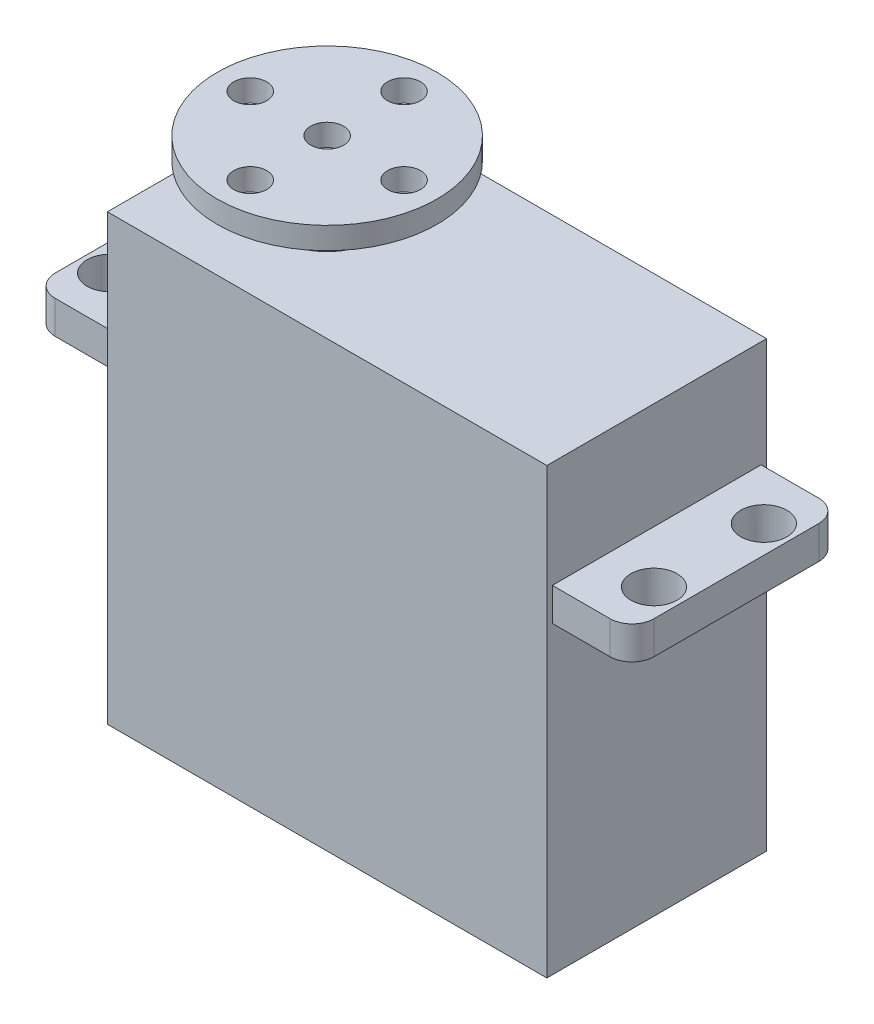
ISO-10303-21;
HEADER;
FILE_DESCRIPTION(('STEP AP214'),'2;1');
FILE_NAME('part.step','',(''),(''),'','','');
FILE_SCHEMA(('AUTOMOTIVE_DESIGN { 1 0 10303 214 1 1 1 1 }'));
ENDSEC;
DATA;
#1=APPLICATION_CONTEXT('core data for automotive mechanical design processes');
#2=APPLICATION_PROTOCOL_DEFINITION('international standard','automotive_design',2000,#1);
#3=PRODUCT_CONTEXT('',#1,'mechanical');
#4=PRODUCT('Part','Part','',(#3));
#5=PRODUCT_RELATED_PRODUCT_CATEGORY('part','',(#4));
#6=PRODUCT_DEFINITION_FORMATION('','',#4);
#7=PRODUCT_DEFINITION_CONTEXT('part definition',#1,'design');
#8=PRODUCT_DEFINITION('design','',#6,#7);
#9=PRODUCT_DEFINITION_SHAPE('','',#8);
#10=(LENGTH_UNIT() NAMED_UNIT(*) SI_UNIT(.MILLI.,.METRE.));
#11=(NAMED_UNIT(*) PLANE_ANGLE_UNIT() SI_UNIT($,.RADIAN.));
#12=(NAMED_UNIT(*) SI_UNIT($,.STERADIAN.) SOLID_ANGLE_UNIT());
#13=UNCERTAINTY_MEASURE_WITH_UNIT(LENGTH_MEASURE(1.E-05),#10,'distance_accuracy_value','');
#14=(GEOMETRIC_REPRESENTATION_CONTEXT(3) GLOBAL_UNCERTAINTY_ASSIGNED_CONTEXT((#13)) GLOBAL_UNIT_ASSIGNED_CONTEXT((#10,
#11,#12)) REPRESENTATION_CONTEXT('',''));
#15=CARTESIAN_POINT('',(0.,0.,0.));
#16=DIRECTION('',(0.,0.,1.));
#17=DIRECTION('',(1.,0.,0.));
#18=AXIS2_PLACEMENT_3D('',#15,#16,#17);
#19=CARTESIAN_POINT('',(-10.,32.55,0.));
#20=DIRECTION('',(0.,1.,0.));
#21=DIRECTION('',(0.,0.,1.));
#22=AXIS2_PLACEMENT_3D('',#19,#20,#21);
#23=PLANE('',#22);
#24=CARTESIAN_POINT('',(-17.,32.55,0.));
#25=DIRECTION('',(0.,1.,0.));
#26=DIRECTION('',(0.,0.,1.));
#27=AXIS2_PLACEMENT_3D('',#24,#25,#26);
#28=CIRCLE('',#27,1.5);
#29=CARTESIAN_POINT('',(-17.,32.55,1.5));
#30=VERTEX_POINT('',#29);
#31=EDGE_CURVE('E102',#30,#30,#28,.T.);
#32=ORIENTED_EDGE('',*,*,#31,.F.);
#33=EDGE_LOOP('',(#32));
#34=FACE_BOUND('',#33,.T.);
#35=CARTESIAN_POINT('',(-3.,32.55,0.));
#36=DIRECTION('',(0.,1.,0.));
#37=DIRECTION('',(0.,0.,1.));
#38=AXIS2_PLACEMENT_3D('',#35,#36,#37);
#39=CIRCLE('',#38,1.5);
#40=CARTESIAN_POINT('',(-3.,32.55,1.5));
#41=VERTEX_POINT('',#40);
#42=EDGE_CURVE('E90',#41,#41,#39,.T.);
#43=ORIENTED_EDGE('',*,*,#42,.F.);
#44=EDGE_LOOP('',(#43));
#45=FACE_BOUND('',#44,.T.);
#46=CARTESIAN_POINT('',(-10.,32.55,0.));
#47=DIRECTION('',(0.,1.,0.));
#48=DIRECTION('',(0.,0.,1.));
#49=AXIS2_PLACEMENT_3D('',#46,#47,#48);
#50=CIRCLE('',#49,10.);
#51=CARTESIAN_POINT('',(-10.,32.55,10.));
#52=VERTEX_POINT('',#51);
#53=EDGE_CURVE('E12',#52,#52,#50,.T.);
#54=ORIENTED_EDGE('',*,*,#53,.T.);
#55=EDGE_LOOP('',(#54));
#56=FACE_BOUND('',#55,.T.);
#57=CARTESIAN_POINT('',(-10.,32.55,-7.));
#58=DIRECTION('',(0.,1.,0.));
#59=DIRECTION('',(0.,0.,1.));
#60=AXIS2_PLACEMENT_3D('',#57,#58,#59);
#61=CIRCLE('',#60,1.5);
#62=CARTESIAN_POINT('',(-10.,32.55,-5.5));
#63=VERTEX_POINT('',#62);
#64=EDGE_CURVE('E85',#63,#63,#61,.T.);
#65=ORIENTED_EDGE('',*,*,#64,.F.);
#66=EDGE_LOOP('',(#65));
#67=FACE_BOUND('',#66,.T.);
#68=CARTESIAN_POINT('',(-10.,32.55,7.));
#69=DIRECTION('',(0.,1.,0.));
#70=DIRECTION('',(0.,0.,1.));
#71=AXIS2_PLACEMENT_3D('',#68,#69,#70);
#72=CIRCLE('',#71,1.5);
#73=CARTESIAN_POINT('',(-10.,32.55,8.5));
#74=VERTEX_POINT('',#73);
#75=EDGE_CURVE('E96',#74,#74,#72,.T.);
#76=ORIENTED_EDGE('',*,*,#75,.F.);
#77=EDGE_LOOP('',(#76));
#78=FACE_BOUND('',#77,.T.);
#79=CARTESIAN_POINT('',(-10.,32.55,0.));
#80=DIRECTION('',(0.,1.,0.));
#81=DIRECTION('',(0.,0.,1.));
#82=AXIS2_PLACEMENT_3D('',#79,#80,#81);
#83=CIRCLE('',#82,1.5);
#84=CARTESIAN_POINT('',(-10.,32.55,1.5));
#85=VERTEX_POINT('',#84);
#86=EDGE_CURVE('E108',#85,#85,#83,.T.);
#87=ORIENTED_EDGE('',*,*,#86,.F.);
#88=EDGE_LOOP('',(#87));
#89=FACE_BOUND('',#88,.T.);
#90=ADVANCED_FACE('F74',(#34,#45,#56,#67,#78,#89),#23,.T.);
#91=CARTESIAN_POINT('',(-10.,30.55,0.));
#92=DIRECTION('',(0.,1.,0.));
#93=DIRECTION('',(0.,0.,1.));
#94=AXIS2_PLACEMENT_3D('',#91,#92,#93);
#95=PLANE('',#94);
#96=CARTESIAN_POINT('',(-10.,30.55,0.));
#97=DIRECTION('',(0.,1.,0.));
#98=DIRECTION('',(0.,0.,1.));
#99=AXIS2_PLACEMENT_3D('',#96,#97,#98);
#100=CIRCLE('',#99,10.);
#101=CARTESIAN_POINT('',(-10.,30.55,10.));
#102=VERTEX_POINT('',#101);
#103=EDGE_CURVE('E78',#102,#102,#100,.T.);
#104=ORIENTED_EDGE('',*,*,#103,.F.);
#105=EDGE_LOOP('',(#104));
#106=FACE_BOUND('',#105,.T.);
#107=CARTESIAN_POINT('',(-10.,30.55,-7.));
#108=DIRECTION('',(0.,1.,0.));
#109=DIRECTION('',(0.,0.,1.));
#110=AXIS2_PLACEMENT_3D('',#107,#108,#109);
#111=CIRCLE('',#110,1.5);
#112=CARTESIAN_POINT('',(-10.,30.55,-5.5));
#113=VERTEX_POINT('',#112);
#114=EDGE_CURVE('E87',#113,#113,#111,.T.);
#115=ORIENTED_EDGE('',*,*,#114,.T.);
#116=EDGE_LOOP('',(#115));
#117=FACE_BOUND('',#116,.T.);
#118=CARTESIAN_POINT('',(-3.,30.55,0.));
#119=DIRECTION('',(0.,1.,0.));
#120=DIRECTION('',(0.,0.,1.));
#121=AXIS2_PLACEMENT_3D('',#118,#119,#120);
#122=CIRCLE('',#121,1.5);
#123=CARTESIAN_POINT('',(-3.,30.55,1.5));
#124=VERTEX_POINT('',#123);
#125=EDGE_CURVE('E93',#124,#124,#122,.T.);
#126=ORIENTED_EDGE('',*,*,#125,.T.);
#127=EDGE_LOOP('',(#126));
#128=FACE_BOUND('',#127,.T.);
#129=CARTESIAN_POINT('',(-10.,30.55,7.));
#130=DIRECTION('',(0.,1.,0.));
#131=DIRECTION('',(0.,0.,1.));
#132=AXIS2_PLACEMENT_3D('',#129,#130,#131);
#133=CIRCLE('',#132,1.5);
#134=CARTESIAN_POINT('',(-10.,30.55,8.5));
#135=VERTEX_POINT('',#134);
#136=EDGE_CURVE('E99',#135,#135,#133,.T.);
#137=ORIENTED_EDGE('',*,*,#136,.T.);
#138=EDGE_LOOP('',(#137));
#139=FACE_BOUND('',#138,.T.);
#140=CARTESIAN_POINT('',(-17.,30.55,0.));
#141=DIRECTION('',(0.,1.,0.));
#142=DIRECTION('',(0.,0.,1.));
#143=AXIS2_PLACEMENT_3D('',#140,#141,#142);
#144=CIRCLE('',#143,1.5);
#145=CARTESIAN_POINT('',(-17.,30.55,1.5));
#146=VERTEX_POINT('',#145);
#147=EDGE_CURVE('E105',#146,#146,#144,.T.);
#148=ORIENTED_EDGE('',*,*,#147,.T.);
#149=EDGE_LOOP('',(#148));
#150=FACE_BOUND('',#149,.T.);
#151=CARTESIAN_POINT('',(-10.,30.55,0.));
#152=DIRECTION('',(0.,1.,0.));
#153=DIRECTION('',(0.,0.,1.));
#154=AXIS2_PLACEMENT_3D('',#151,#152,#153);
#155=CIRCLE('',#154,1.5);
#156=CARTESIAN_POINT('',(-10.,30.55,1.5));
#157=VERTEX_POINT('',#156);
#158=EDGE_CURVE('E111',#157,#157,#155,.T.);
#159=ORIENTED_EDGE('',*,*,#158,.T.);
#160=EDGE_LOOP('',(#159));
#161=FACE_BOUND('',#160,.T.);
#162=ADVANCED_FACE('F121',(#106,#117,#128,#139,#150,#161),#95,.F.);
#163=CARTESIAN_POINT('',(-10.,32.55,0.));
#164=DIRECTION('',(0.,-1.,0.));
#165=DIRECTION('',(0.,0.,-1.));
#166=AXIS2_PLACEMENT_3D('',#163,#164,#165);
#167=CYLINDRICAL_SURFACE('',#166,10.);
#168=ORIENTED_EDGE('',*,*,#53,.F.);
#169=EDGE_LOOP('',(#168));
#170=FACE_BOUND('',#169,.T.);
#171=ORIENTED_EDGE('',*,*,#103,.T.);
#172=EDGE_LOOP('',(#171));
#173=FACE_BOUND('',#172,.T.);
#174=ADVANCED_FACE('F76',(#170,#173),#167,.T.);
#175=CARTESIAN_POINT('',(-10.,32.55,-7.));
#176=DIRECTION('',(0.,-1.,0.));
#177=DIRECTION('',(0.,0.,-1.));
#178=AXIS2_PLACEMENT_3D('',#175,#176,#177);
#179=CYLINDRICAL_SURFACE('',#178,1.5);
#180=ORIENTED_EDGE('',*,*,#64,.T.);
#181=EDGE_LOOP('',(#180));
#182=FACE_BOUND('',#181,.T.);
#183=ORIENTED_EDGE('',*,*,#114,.F.);
#184=EDGE_LOOP('',(#183));
#185=FACE_BOUND('',#184,.T.);
#186=ADVANCED_FACE('F131',(#182,#185),#179,.F.);
#187=CARTESIAN_POINT('',(-3.,32.55,0.));
#188=DIRECTION('',(0.,-1.,0.));
#189=DIRECTION('',(0.,0.,-1.));
#190=AXIS2_PLACEMENT_3D('',#187,#188,#189);
#191=CYLINDRICAL_SURFACE('',#190,1.5);
#192=ORIENTED_EDGE('',*,*,#42,.T.);
#193=EDGE_LOOP('',(#192));
#194=FACE_BOUND('',#193,.T.);
#195=ORIENTED_EDGE('',*,*,#125,.F.);
#196=EDGE_LOOP('',(#195));
#197=FACE_BOUND('',#196,.T.);
#198=ADVANCED_FACE('F134',(#194,#197),#191,.F.);
#199=CARTESIAN_POINT('',(-10.,32.55,7.));
#200=DIRECTION('',(0.,-1.,0.));
#201=DIRECTION('',(0.,0.,-1.));
#202=AXIS2_PLACEMENT_3D('',#199,#200,#201);
#203=CYLINDRICAL_SURFACE('',#202,1.5);
#204=ORIENTED_EDGE('',*,*,#75,.T.);
#205=EDGE_LOOP('',(#204));
#206=FACE_BOUND('',#205,.T.);
#207=ORIENTED_EDGE('',*,*,#136,.F.);
#208=EDGE_LOOP('',(#207));
#209=FACE_BOUND('',#208,.T.);
#210=ADVANCED_FACE('F138',(#206,#209),#203,.F.);
#211=CARTESIAN_POINT('',(-17.,32.55,0.));
#212=DIRECTION('',(0.,-1.,0.));
#213=DIRECTION('',(0.,0.,-1.));
#214=AXIS2_PLACEMENT_3D('',#211,#212,#213);
#215=CYLINDRICAL_SURFACE('',#214,1.5);
#216=ORIENTED_EDGE('',*,*,#31,.T.);
#217=EDGE_LOOP('',(#216));
#218=FACE_BOUND('',#217,.T.);
#219=ORIENTED_EDGE('',*,*,#147,.F.);
#220=EDGE_LOOP('',(#219));
#221=FACE_BOUND('',#220,.T.);
#222=ADVANCED_FACE('F142',(#218,#221),#215,.F.);
#223=CARTESIAN_POINT('',(-10.,32.55,0.));
#224=DIRECTION('',(0.,-1.,0.));
#225=DIRECTION('',(0.,0.,-1.));
#226=AXIS2_PLACEMENT_3D('',#223,#224,#225);
#227=CYLINDRICAL_SURFACE('',#226,1.5);
#228=ORIENTED_EDGE('',*,*,#86,.T.);
#229=EDGE_LOOP('',(#228));
#230=FACE_BOUND('',#229,.T.);
#231=ORIENTED_EDGE('',*,*,#158,.F.);
#232=EDGE_LOOP('',(#231));
#233=FACE_BOUND('',#232,.T.);
#234=ADVANCED_FACE('F117',(#230,#233),#227,.F.);
#235=CLOSED_SHELL('',(#90,#162,#174,#186,#198,#210,#222,#234));
#236=MANIFOLD_SOLID_BREP('B2',#235);
#237=CARTESIAN_POINT('',(0.,16.85,0.));
#238=DIRECTION('',(0.,1.,0.));
#239=DIRECTION('',(0.,0.,1.));
#240=AXIS2_PLACEMENT_3D('',#237,#238,#239);
#241=PLANE('',#240);
#242=CARTESIAN_POINT('',(-24.75,16.85,5.));
#243=DIRECTION('',(0.,1.,0.));
#244=DIRECTION('',(0.,0.,1.));
#245=AXIS2_PLACEMENT_3D('',#242,#243,#244);
#246=CIRCLE('',#245,2.1);
#247=CARTESIAN_POINT('',(-24.75,16.85,7.1));
#248=VERTEX_POINT('',#247);
#249=EDGE_CURVE('E484',#248,#248,#246,.T.);
#250=ORIENTED_EDGE('',*,*,#249,.F.);
#251=EDGE_LOOP('',(#250));
#252=FACE_BOUND('',#251,.T.);
#253=CARTESIAN_POINT('',(-24.75,16.85,-5.));
#254=DIRECTION('',(0.,1.,0.));
#255=DIRECTION('',(0.,0.,1.));
#256=AXIS2_PLACEMENT_3D('',#253,#254,#255);
#257=CIRCLE('',#256,2.1);
#258=CARTESIAN_POINT('',(-24.75,16.85,-2.9));
#259=VERTEX_POINT('',#258);
#260=EDGE_CURVE('E480',#259,#259,#257,.T.);
#261=ORIENTED_EDGE('',*,*,#260,.F.);
#262=EDGE_LOOP('',(#261));
#263=FACE_BOUND('',#262,.T.);
#264=DIRECTION('',(0.,0.,1.));
#265=VECTOR('',#264,1.);
#266=CARTESIAN_POINT('',(-20.,16.85,-10.));
#267=LINE('',#266,#265);
#268=CARTESIAN_POINT('',(-20.,16.85,-9.5));
#269=VERTEX_POINT('',#268);
#270=CARTESIAN_POINT('',(-20.,16.85,9.5));
#271=VERTEX_POINT('',#270);
#272=EDGE_CURVE('E72',#269,#271,#267,.T.);
#273=ORIENTED_EDGE('',*,*,#272,.F.);
#274=DIRECTION('',(1.,0.,0.));
#275=VECTOR('',#274,1.);
#276=CARTESIAN_POINT('',(-27.25,16.85,-9.5));
#277=LINE('',#276,#275);
#278=CARTESIAN_POINT('',(-25.25,16.85,-9.5));
#279=VERTEX_POINT('',#278);
#280=EDGE_CURVE('E400',#279,#269,#277,.T.);
#281=ORIENTED_EDGE('',*,*,#280,.F.);
#282=CARTESIAN_POINT('',(-25.25,16.85,-7.5));
#283=DIRECTION('',(0.,1.,0.));
#284=DIRECTION('',(0.,0.,1.));
#285=AXIS2_PLACEMENT_3D('',#282,#283,#284);
#286=CIRCLE('',#285,2.);
#287=CARTESIAN_POINT('',(-27.25,16.85,-7.5));
#288=VERTEX_POINT('',#287);
#289=EDGE_CURVE('E458',#279,#288,#286,.T.);
#290=ORIENTED_EDGE('',*,*,#289,.T.);
#291=DIRECTION('',(0.,0.,1.));
#292=VECTOR('',#291,1.);
#293=CARTESIAN_POINT('',(-27.25,16.85,-9.5));
#294=LINE('',#293,#292);
#295=CARTESIAN_POINT('',(-27.25,16.85,7.5));
#296=VERTEX_POINT('',#295);
#297=EDGE_CURVE('E388',#288,#296,#294,.T.);
#298=ORIENTED_EDGE('',*,*,#297,.T.);
#299=CARTESIAN_POINT('',(-25.25,16.85,7.5));
#300=DIRECTION('',(0.,1.,0.));
#301=DIRECTION('',(0.,0.,1.));
#302=AXIS2_PLACEMENT_3D('',#299,#300,#301);
#303=CIRCLE('',#302,2.);
#304=CARTESIAN_POINT('',(-25.25,16.85,9.5));
#305=VERTEX_POINT('',#304);
#306=EDGE_CURVE('E452',#296,#305,#303,.T.);
#307=ORIENTED_EDGE('',*,*,#306,.T.);
#308=DIRECTION('',(1.,0.,0.));
#309=VECTOR('',#308,1.);
#310=CARTESIAN_POINT('',(-27.25,16.85,9.5));
#311=LINE('',#310,#309);
#312=EDGE_CURVE('E393',#305,#271,#311,.T.);
#313=ORIENTED_EDGE('',*,*,#312,.T.);
#314=EDGE_LOOP('',(#273,#281,#290,#298,#307,#313));
#315=FACE_BOUND('',#314,.T.);
#316=ADVANCED_FACE('F235',(#252,#263,#315),#241,.T.);
#317=CARTESIAN_POINT('',(20.,13.85,10.));
#318=DIRECTION('',(-1.,0.,0.));
#319=DIRECTION('',(0.,0.,1.));
#320=AXIS2_PLACEMENT_3D('',#317,#318,#319);
#321=PLANE('',#320);
#322=DIRECTION('',(0.,0.,-1.));
#323=VECTOR('',#322,1.);
#324=CARTESIAN_POINT('',(20.,26.55,10.));
#325=LINE('',#324,#323);
#326=CARTESIAN_POINT('',(20.,26.55,10.));
#327=VERTEX_POINT('',#326);
#328=CARTESIAN_POINT('',(20.,26.55,-10.));
#329=VERTEX_POINT('',#328);
#330=EDGE_CURVE('E370',#327,#329,#325,.T.);
#331=ORIENTED_EDGE('',*,*,#330,.F.);
#332=DIRECTION('',(0.,1.,0.));
#333=VECTOR('',#332,1.);
#334=CARTESIAN_POINT('',(20.,13.85,10.));
#335=LINE('',#334,#333);
#336=CARTESIAN_POINT('',(20.,-13.85,10.));
#337=VERTEX_POINT('',#336);
#338=EDGE_CURVE('E361',#337,#327,#335,.T.);
#339=ORIENTED_EDGE('',*,*,#338,.F.);
#340=DIRECTION('',(0.,0.,-1.));
#341=VECTOR('',#340,1.);
#342=CARTESIAN_POINT('',(20.,-13.85,10.));
#343=LINE('',#342,#341);
#344=CARTESIAN_POINT('',(20.,-13.85,-10.));
#345=VERTEX_POINT('',#344);
#346=EDGE_CURVE('E428',#337,#345,#343,.T.);
#347=ORIENTED_EDGE('',*,*,#346,.T.);
#348=DIRECTION('',(0.,1.,0.));
#349=VECTOR('',#348,1.);
#350=CARTESIAN_POINT('',(20.,13.85,-10.));
#351=LINE('',#350,#349);
#352=EDGE_CURVE('E424',#345,#329,#351,.T.);
#353=ORIENTED_EDGE('',*,*,#352,.T.);
#354=EDGE_LOOP('',(#331,#339,#347,#353));
#355=FACE_BOUND('',#354,.T.);
#356=DIRECTION('',(0.,1.,0.));
#357=VECTOR('',#356,1.);
#358=CARTESIAN_POINT('',(20.,16.85,9.5));
#359=LINE('',#358,#357);
#360=CARTESIAN_POINT('',(20.,13.85,9.5));
#361=VERTEX_POINT('',#360);
#362=CARTESIAN_POINT('',(20.,16.85,9.5));
#363=VERTEX_POINT('',#362);
#364=EDGE_CURVE('E415',#361,#363,#359,.T.);
#365=ORIENTED_EDGE('',*,*,#364,.T.);
#366=DIRECTION('',(0.,0.,-1.));
#367=VECTOR('',#366,1.);
#368=CARTESIAN_POINT('',(20.,16.85,10.));
#369=LINE('',#368,#367);
#370=CARTESIAN_POINT('',(20.,16.85,-9.5));
#371=VERTEX_POINT('',#370);
#372=EDGE_CURVE('E244',#363,#371,#369,.T.);
#373=ORIENTED_EDGE('',*,*,#372,.T.);
#374=DIRECTION('',(0.,1.,0.));
#375=VECTOR('',#374,1.);
#376=CARTESIAN_POINT('',(20.,16.85,-9.5));
#377=LINE('',#376,#375);
#378=CARTESIAN_POINT('',(20.,13.85,-9.5));
#379=VERTEX_POINT('',#378);
#380=EDGE_CURVE('E403',#379,#371,#377,.T.);
#381=ORIENTED_EDGE('',*,*,#380,.F.);
#382=DIRECTION('',(0.,0.,-1.));
#383=VECTOR('',#382,1.);
#384=CARTESIAN_POINT('',(20.,13.85,10.));
#385=LINE('',#384,#383);
#386=EDGE_CURVE('E439',#361,#379,#385,.T.);
#387=ORIENTED_EDGE('',*,*,#386,.F.);
#388=EDGE_LOOP('',(#365,#373,#381,#387));
#389=FACE_BOUND('',#388,.T.);
#390=ADVANCED_FACE('F526',(#355,#389),#321,.F.);
#391=CARTESIAN_POINT('',(-20.,13.85,10.));
#392=DIRECTION('',(1.,0.,0.));
#393=DIRECTION('',(0.,1.,0.));
#394=AXIS2_PLACEMENT_3D('',#391,#392,#393);
#395=PLANE('',#394);
#396=DIRECTION('',(0.,1.,0.));
#397=VECTOR('',#396,1.);
#398=CARTESIAN_POINT('',(-20.,16.85,-9.5));
#399=LINE('',#398,#397);
#400=CARTESIAN_POINT('',(-20.,13.85,-9.5));
#401=VERTEX_POINT('',#400);
#402=EDGE_CURVE('E416',#401,#269,#399,.T.);
#403=ORIENTED_EDGE('',*,*,#402,.T.);
#404=ORIENTED_EDGE('',*,*,#272,.T.);
#405=DIRECTION('',(0.,1.,0.));
#406=VECTOR('',#405,1.);
#407=CARTESIAN_POINT('',(-20.,16.85,9.5));
#408=LINE('',#407,#406);
#409=CARTESIAN_POINT('',(-20.,13.85,9.5));
#410=VERTEX_POINT('',#409);
#411=EDGE_CURVE('E419',#410,#271,#408,.T.);
#412=ORIENTED_EDGE('',*,*,#411,.F.);
#413=DIRECTION('',(0.,0.,-1.));
#414=VECTOR('',#413,1.);
#415=CARTESIAN_POINT('',(-20.,13.85,10.));
#416=LINE('',#415,#414);
#417=EDGE_CURVE('E436',#410,#401,#416,.T.);
#418=ORIENTED_EDGE('',*,*,#417,.T.);
#419=EDGE_LOOP('',(#403,#404,#412,#418));
#420=FACE_BOUND('',#419,.T.);
#421=DIRECTION('',(0.,-1.,0.));
#422=VECTOR('',#421,1.);
#423=CARTESIAN_POINT('',(-20.,13.85,-10.));
#424=LINE('',#423,#422);
#425=CARTESIAN_POINT('',(-20.,26.55,-10.));
#426=VERTEX_POINT('',#425);
#427=CARTESIAN_POINT('',(-20.,-13.85,-10.));
#428=VERTEX_POINT('',#427);
#429=EDGE_CURVE('E430',#426,#428,#424,.T.);
#430=ORIENTED_EDGE('',*,*,#429,.T.);
#431=DIRECTION('',(0.,0.,-1.));
#432=VECTOR('',#431,1.);
#433=CARTESIAN_POINT('',(-20.,-13.85,10.));
#434=LINE('',#433,#432);
#435=CARTESIAN_POINT('',(-20.,-13.85,10.));
#436=VERTEX_POINT('',#435);
#437=EDGE_CURVE('E357',#436,#428,#434,.T.);
#438=ORIENTED_EDGE('',*,*,#437,.F.);
#439=DIRECTION('',(0.,-1.,0.));
#440=VECTOR('',#439,1.);
#441=CARTESIAN_POINT('',(-20.,13.85,10.));
#442=LINE('',#441,#440);
#443=CARTESIAN_POINT('',(-20.,26.55,10.));
#444=VERTEX_POINT('',#443);
#445=EDGE_CURVE('E351',#444,#436,#442,.T.);
#446=ORIENTED_EDGE('',*,*,#445,.F.);
#447=DIRECTION('',(0.,0.,1.));
#448=VECTOR('',#447,1.);
#449=CARTESIAN_POINT('',(-20.,26.55,-10.));
#450=LINE('',#449,#448);
#451=EDGE_CURVE('E355',#426,#444,#450,.T.);
#452=ORIENTED_EDGE('',*,*,#451,.F.);
#453=EDGE_LOOP('',(#430,#438,#446,#452));
#454=FACE_BOUND('',#453,.T.);
#455=ADVANCED_FACE('F353',(#420,#454),#395,.F.);
#456=CARTESIAN_POINT('',(-20.,-13.85,10.));
#457=DIRECTION('',(0.,1.,0.));
#458=DIRECTION('',(0.,0.,1.));
#459=AXIS2_PLACEMENT_3D('',#456,#457,#458);
#460=PLANE('',#459);
#461=DIRECTION('',(1.,0.,0.));
#462=VECTOR('',#461,1.);
#463=CARTESIAN_POINT('',(-20.,-13.85,-10.));
#464=LINE('',#463,#462);
#465=EDGE_CURVE('E425',#428,#345,#464,.T.);
#466=ORIENTED_EDGE('',*,*,#465,.T.);
#467=ORIENTED_EDGE('',*,*,#346,.F.);
#468=DIRECTION('',(1.,0.,0.));
#469=VECTOR('',#468,1.);
#470=CARTESIAN_POINT('',(-20.,-13.85,10.));
#471=LINE('',#470,#469);
#472=EDGE_CURVE('E360',#436,#337,#471,.T.);
#473=ORIENTED_EDGE('',*,*,#472,.F.);
#474=ORIENTED_EDGE('',*,*,#437,.T.);
#475=EDGE_LOOP('',(#466,#467,#473,#474));
#476=FACE_BOUND('',#475,.T.);
#477=ADVANCED_FACE('F594',(#476),#460,.F.);
#478=CARTESIAN_POINT('',(0.,0.,10.));
#479=DIRECTION('',(0.,0.,1.));
#480=DIRECTION('',(1.,0.,0.));
#481=AXIS2_PLACEMENT_3D('',#478,#479,#480);
#482=PLANE('',#481);
#483=ORIENTED_EDGE('',*,*,#338,.T.);
#484=DIRECTION('',(1.,0.,0.));
#485=VECTOR('',#484,1.);
#486=CARTESIAN_POINT('',(-20.,26.55,10.));
#487=LINE('',#486,#485);
#488=EDGE_CURVE('E364',#444,#327,#487,.T.);
#489=ORIENTED_EDGE('',*,*,#488,.F.);
#490=ORIENTED_EDGE('',*,*,#445,.T.);
#491=ORIENTED_EDGE('',*,*,#472,.T.);
#492=EDGE_LOOP('',(#483,#489,#490,#491));
#493=FACE_BOUND('',#492,.T.);
#494=ADVANCED_FACE('F365',(#493),#482,.T.);
#495=CARTESIAN_POINT('',(0.,0.,-10.));
#496=DIRECTION('',(0.,0.,1.));
#497=DIRECTION('',(1.,0.,0.));
#498=AXIS2_PLACEMENT_3D('',#495,#496,#497);
#499=PLANE('',#498);
#500=ORIENTED_EDGE('',*,*,#352,.F.);
#501=ORIENTED_EDGE('',*,*,#465,.F.);
#502=ORIENTED_EDGE('',*,*,#429,.F.);
#503=DIRECTION('',(-1.,0.,0.));
#504=VECTOR('',#503,1.);
#505=CARTESIAN_POINT('',(20.,26.55,-10.));
#506=LINE('',#505,#504);
#507=EDGE_CURVE('E375',#329,#426,#506,.T.);
#508=ORIENTED_EDGE('',*,*,#507,.F.);
#509=EDGE_LOOP('',(#500,#501,#502,#508));
#510=FACE_BOUND('',#509,.T.);
#511=ADVANCED_FACE('F576',(#510),#499,.F.);
#512=CARTESIAN_POINT('',(0.,13.85,0.));
#513=DIRECTION('',(0.,1.,0.));
#514=DIRECTION('',(0.,0.,1.));
#515=AXIS2_PLACEMENT_3D('',#512,#513,#514);
#516=PLANE('',#515);
#517=CARTESIAN_POINT('',(24.75,13.85,-5.));
#518=DIRECTION('',(0.,1.,0.));
#519=DIRECTION('',(0.,0.,1.));
#520=AXIS2_PLACEMENT_3D('',#517,#518,#519);
#521=CIRCLE('',#520,2.1);
#522=CARTESIAN_POINT('',(24.75,13.85,-2.9));
#523=VERTEX_POINT('',#522);
#524=EDGE_CURVE('E380',#523,#523,#521,.T.);
#525=ORIENTED_EDGE('',*,*,#524,.T.);
#526=EDGE_LOOP('',(#525));
#527=FACE_BOUND('',#526,.T.);
#528=CARTESIAN_POINT('',(24.75,13.85,5.));
#529=DIRECTION('',(0.,1.,0.));
#530=DIRECTION('',(0.,0.,1.));
#531=AXIS2_PLACEMENT_3D('',#528,#529,#530);
#532=CIRCLE('',#531,2.1);
#533=CARTESIAN_POINT('',(24.75,13.85,7.1));
#534=VERTEX_POINT('',#533);
#535=EDGE_CURVE('E476',#534,#534,#532,.T.);
#536=ORIENTED_EDGE('',*,*,#535,.T.);
#537=EDGE_LOOP('',(#536));
#538=FACE_BOUND('',#537,.T.);
#539=DIRECTION('',(1.,0.,0.));
#540=VECTOR('',#539,1.);
#541=CARTESIAN_POINT('',(-27.25,13.85,-9.5));
#542=LINE('',#541,#540);
#543=CARTESIAN_POINT('',(25.25,13.85,-9.5));
#544=VERTEX_POINT('',#543);
#545=EDGE_CURVE('E411',#379,#544,#542,.T.);
#546=ORIENTED_EDGE('',*,*,#545,.T.);
#547=CARTESIAN_POINT('',(25.25,13.85,-7.5));
#548=DIRECTION('',(0.,1.,0.));
#549=DIRECTION('',(0.,0.,1.));
#550=AXIS2_PLACEMENT_3D('',#547,#548,#549);
#551=CIRCLE('',#550,2.);
#552=CARTESIAN_POINT('',(27.25,13.85,-7.5));
#553=VERTEX_POINT('',#552);
#554=EDGE_CURVE('E260',#544,#553,#551,.F.);
#555=ORIENTED_EDGE('',*,*,#554,.T.);
#556=DIRECTION('',(0.,0.,1.));
#557=VECTOR('',#556,1.);
#558=CARTESIAN_POINT('',(27.25,13.85,-9.5));
#559=LINE('',#558,#557);
#560=CARTESIAN_POINT('',(27.25,13.85,7.5));
#561=VERTEX_POINT('',#560);
#562=EDGE_CURVE('E409',#553,#561,#559,.T.);
#563=ORIENTED_EDGE('',*,*,#562,.T.);
#564=CARTESIAN_POINT('',(25.25,13.85,7.5));
#565=DIRECTION('',(0.,1.,0.));
#566=DIRECTION('',(0.,0.,1.));
#567=AXIS2_PLACEMENT_3D('',#564,#565,#566);
#568=CIRCLE('',#567,2.);
#569=CARTESIAN_POINT('',(25.25,13.85,9.5));
#570=VERTEX_POINT('',#569);
#571=EDGE_CURVE('E252',#561,#570,#568,.F.);
#572=ORIENTED_EDGE('',*,*,#571,.T.);
#573=DIRECTION('',(1.,0.,0.));
#574=VECTOR('',#573,1.);
#575=CARTESIAN_POINT('',(-27.25,13.85,9.5));
#576=LINE('',#575,#574);
#577=EDGE_CURVE('E406',#361,#570,#576,.T.);
#578=ORIENTED_EDGE('',*,*,#577,.F.);
#579=ORIENTED_EDGE('',*,*,#386,.T.);
#580=EDGE_LOOP('',(#546,#555,#563,#572,#578,#579));
#581=FACE_BOUND('',#580,.T.);
#582=ADVANCED_FACE('F549',(#527,#538,#581),#516,.F.);
#583=CARTESIAN_POINT('',(-24.75,13.85,5.));
#584=DIRECTION('',(0.,1.,0.));
#585=DIRECTION('',(0.,0.,1.));
#586=AXIS2_PLACEMENT_3D('',#583,#584,#585);
#587=CIRCLE('',#586,2.1);
#588=CARTESIAN_POINT('',(-24.75,13.85,7.1));
#589=VERTEX_POINT('',#588);
#590=EDGE_CURVE('E239',#589,#589,#587,.T.);
#591=ORIENTED_EDGE('',*,*,#590,.T.);
#592=EDGE_LOOP('',(#591));
#593=FACE_BOUND('',#592,.T.);
#594=CARTESIAN_POINT('',(-24.75,13.85,-5.));
#595=DIRECTION('',(0.,1.,0.));
#596=DIRECTION('',(0.,0.,1.));
#597=AXIS2_PLACEMENT_3D('',#594,#595,#596);
#598=CIRCLE('',#597,2.1);
#599=CARTESIAN_POINT('',(-24.75,13.85,-2.9));
#600=VERTEX_POINT('',#599);
#601=EDGE_CURVE('E378',#600,#600,#598,.T.);
#602=ORIENTED_EDGE('',*,*,#601,.T.);
#603=EDGE_LOOP('',(#602));
#604=FACE_BOUND('',#603,.T.);
#605=DIRECTION('',(0.,0.,1.));
#606=VECTOR('',#605,1.);
#607=CARTESIAN_POINT('',(-27.25,13.85,-9.5));
#608=LINE('',#607,#606);
#609=CARTESIAN_POINT('',(-27.25,13.85,-7.5));
#610=VERTEX_POINT('',#609);
#611=CARTESIAN_POINT('',(-27.25,13.85,7.5));
#612=VERTEX_POINT('',#611);
#613=EDGE_CURVE('E384',#610,#612,#608,.T.);
#614=ORIENTED_EDGE('',*,*,#613,.F.);
#615=CARTESIAN_POINT('',(-25.25,13.85,-7.5));
#616=DIRECTION('',(0.,1.,0.));
#617=DIRECTION('',(0.,0.,1.));
#618=AXIS2_PLACEMENT_3D('',#615,#616,#617);
#619=CIRCLE('',#618,2.);
#620=CARTESIAN_POINT('',(-25.25,13.85,-9.5));
#621=VERTEX_POINT('',#620);
#622=EDGE_CURVE('E448',#610,#621,#619,.F.);
#623=ORIENTED_EDGE('',*,*,#622,.T.);
#624=EDGE_CURVE('E392',#621,#401,#542,.T.);
#625=ORIENTED_EDGE('',*,*,#624,.T.);
#626=ORIENTED_EDGE('',*,*,#417,.F.);
#627=CARTESIAN_POINT('',(-25.25,13.85,9.5));
#628=VERTEX_POINT('',#627);
#629=EDGE_CURVE('E407',#628,#410,#576,.T.);
#630=ORIENTED_EDGE('',*,*,#629,.F.);
#631=CARTESIAN_POINT('',(-25.25,13.85,7.5));
#632=DIRECTION('',(0.,1.,0.));
#633=DIRECTION('',(0.,0.,1.));
#634=AXIS2_PLACEMENT_3D('',#631,#632,#633);
#635=CIRCLE('',#634,2.);
#636=EDGE_CURVE('E446',#628,#612,#635,.F.);
#637=ORIENTED_EDGE('',*,*,#636,.T.);
#638=EDGE_LOOP('',(#614,#623,#625,#626,#630,#637));
#639=FACE_BOUND('',#638,.T.);
#640=ADVANCED_FACE('F539',(#593,#604,#639),#516,.F.);
#641=CARTESIAN_POINT('',(24.75,16.85,-5.));
#642=DIRECTION('',(0.,1.,0.));
#643=DIRECTION('',(0.,0.,-1.));
#644=AXIS2_PLACEMENT_3D('',#641,#642,#643);
#645=CIRCLE('',#644,2.1);
#646=CARTESIAN_POINT('',(24.75,16.85,-7.10000000000001));
#647=VERTEX_POINT('',#646);
#648=EDGE_CURVE('E487',#647,#647,#645,.T.);
#649=ORIENTED_EDGE('',*,*,#648,.F.);
#650=EDGE_LOOP('',(#649));
#651=FACE_BOUND('',#650,.T.);
#652=CARTESIAN_POINT('',(24.75,16.85,5.));
#653=DIRECTION('',(0.,1.,0.));
#654=DIRECTION('',(0.,0.,-1.));
#655=AXIS2_PLACEMENT_3D('',#652,#653,#654);
#656=CIRCLE('',#655,2.1);
#657=CARTESIAN_POINT('',(24.75,16.85,2.9));
#658=VERTEX_POINT('',#657);
#659=EDGE_CURVE('E490',#658,#658,#656,.T.);
#660=ORIENTED_EDGE('',*,*,#659,.F.);
#661=EDGE_LOOP('',(#660));
#662=FACE_BOUND('',#661,.T.);
#663=ORIENTED_EDGE('',*,*,#372,.F.);
#664=CARTESIAN_POINT('',(25.25,16.85,9.5));
#665=VERTEX_POINT('',#664);
#666=EDGE_CURVE('E391',#363,#665,#311,.T.);
#667=ORIENTED_EDGE('',*,*,#666,.T.);
#668=CARTESIAN_POINT('',(25.25,16.85,7.5));
#669=DIRECTION('',(0.,1.,0.));
#670=DIRECTION('',(0.,0.,1.));
#671=AXIS2_PLACEMENT_3D('',#668,#669,#670);
#672=CIRCLE('',#671,2.);
#673=CARTESIAN_POINT('',(27.25,16.85,7.5));
#674=VERTEX_POINT('',#673);
#675=EDGE_CURVE('E454',#665,#674,#672,.T.);
#676=ORIENTED_EDGE('',*,*,#675,.T.);
#677=DIRECTION('',(0.,0.,1.));
#678=VECTOR('',#677,1.);
#679=CARTESIAN_POINT('',(27.25,16.85,-9.5));
#680=LINE('',#679,#678);
#681=CARTESIAN_POINT('',(27.25,16.85,-7.5));
#682=VERTEX_POINT('',#681);
#683=EDGE_CURVE('E396',#682,#674,#680,.T.);
#684=ORIENTED_EDGE('',*,*,#683,.F.);
#685=CARTESIAN_POINT('',(25.25,16.85,-7.5));
#686=DIRECTION('',(0.,1.,0.));
#687=DIRECTION('',(0.,0.,1.));
#688=AXIS2_PLACEMENT_3D('',#685,#686,#687);
#689=CIRCLE('',#688,2.);
#690=CARTESIAN_POINT('',(25.25,16.85,-9.5));
#691=VERTEX_POINT('',#690);
#692=EDGE_CURVE('E456',#682,#691,#689,.T.);
#693=ORIENTED_EDGE('',*,*,#692,.T.);
#694=EDGE_CURVE('E399',#371,#691,#277,.T.);
#695=ORIENTED_EDGE('',*,*,#694,.F.);
#696=EDGE_LOOP('',(#663,#667,#676,#684,#693,#695));
#697=FACE_BOUND('',#696,.T.);
#698=ADVANCED_FACE('F528',(#651,#662,#697),#241,.T.);
#699=CARTESIAN_POINT('',(-27.25,16.85,9.5));
#700=DIRECTION('',(0.,0.,-1.));
#701=DIRECTION('',(-1.,0.,0.));
#702=AXIS2_PLACEMENT_3D('',#699,#700,#701);
#703=PLANE('',#702);
#704=ORIENTED_EDGE('',*,*,#577,.T.);
#705=DIRECTION('',(0.,-1.,0.));
#706=VECTOR('',#705,1.);
#707=CARTESIAN_POINT('',(25.25,16.85,9.5));
#708=LINE('',#707,#706);
#709=EDGE_CURVE('E469',#570,#665,#708,.F.);
#710=ORIENTED_EDGE('',*,*,#709,.T.);
#711=ORIENTED_EDGE('',*,*,#666,.F.);
#712=ORIENTED_EDGE('',*,*,#364,.F.);
#713=EDGE_LOOP('',(#704,#710,#711,#712));
#714=FACE_BOUND('',#713,.T.);
#715=ADVANCED_FACE('F538',(#714),#703,.F.);
#716=CARTESIAN_POINT('',(27.25,16.85,-9.5));
#717=DIRECTION('',(1.,0.,0.));
#718=DIRECTION('',(0.,0.,-1.));
#719=AXIS2_PLACEMENT_3D('',#716,#717,#718);
#720=PLANE('',#719);
#721=ORIENTED_EDGE('',*,*,#562,.F.);
#722=DIRECTION('',(0.,-1.,0.));
#723=VECTOR('',#722,1.);
#724=CARTESIAN_POINT('',(27.25,16.85,-7.5));
#725=LINE('',#724,#723);
#726=EDGE_CURVE('E467',#553,#682,#725,.F.);
#727=ORIENTED_EDGE('',*,*,#726,.T.);
#728=ORIENTED_EDGE('',*,*,#683,.T.);
#729=DIRECTION('',(0.,-1.,0.));
#730=VECTOR('',#729,1.);
#731=CARTESIAN_POINT('',(27.25,13.85,7.5));
#732=LINE('',#731,#730);
#733=EDGE_CURVE('E465',#674,#561,#732,.T.);
#734=ORIENTED_EDGE('',*,*,#733,.T.);
#735=EDGE_LOOP('',(#721,#727,#728,#734));
#736=FACE_BOUND('',#735,.T.);
#737=ADVANCED_FACE('F545',(#736),#720,.T.);
#738=CARTESIAN_POINT('',(-27.25,16.85,-9.5));
#739=DIRECTION('',(0.,0.,-1.));
#740=DIRECTION('',(-1.,0.,0.));
#741=AXIS2_PLACEMENT_3D('',#738,#739,#740);
#742=PLANE('',#741);
#743=ORIENTED_EDGE('',*,*,#694,.T.);
#744=DIRECTION('',(0.,-1.,0.));
#745=VECTOR('',#744,1.);
#746=CARTESIAN_POINT('',(25.25,16.85,-9.5));
#747=LINE('',#746,#745);
#748=EDGE_CURVE('E460',#691,#544,#747,.T.);
#749=ORIENTED_EDGE('',*,*,#748,.T.);
#750=ORIENTED_EDGE('',*,*,#545,.F.);
#751=ORIENTED_EDGE('',*,*,#380,.T.);
#752=EDGE_LOOP('',(#743,#749,#750,#751));
#753=FACE_BOUND('',#752,.T.);
#754=ADVANCED_FACE('F573',(#753),#742,.T.);
#755=CARTESIAN_POINT('',(-27.25,16.85,-9.5));
#756=DIRECTION('',(1.,0.,0.));
#757=DIRECTION('',(0.,0.,-1.));
#758=AXIS2_PLACEMENT_3D('',#755,#756,#757);
#759=PLANE('',#758);
#760=ORIENTED_EDGE('',*,*,#297,.F.);
#761=DIRECTION('',(0.,-1.,0.));
#762=VECTOR('',#761,1.);
#763=CARTESIAN_POINT('',(-27.25,13.85,-7.5));
#764=LINE('',#763,#762);
#765=EDGE_CURVE('E443',#288,#610,#764,.T.);
#766=ORIENTED_EDGE('',*,*,#765,.T.);
#767=ORIENTED_EDGE('',*,*,#613,.T.);
#768=DIRECTION('',(0.,-1.,0.));
#769=VECTOR('',#768,1.);
#770=CARTESIAN_POINT('',(-27.25,16.85,7.5));
#771=LINE('',#770,#769);
#772=EDGE_CURVE('E441',#612,#296,#771,.F.);
#773=ORIENTED_EDGE('',*,*,#772,.T.);
#774=EDGE_LOOP('',(#760,#766,#767,#773));
#775=FACE_BOUND('',#774,.T.);
#776=ADVANCED_FACE('F585',(#775),#759,.F.);
#777=ORIENTED_EDGE('',*,*,#312,.F.);
#778=DIRECTION('',(0.,-1.,0.));
#779=VECTOR('',#778,1.);
#780=CARTESIAN_POINT('',(-25.25,16.85,9.5));
#781=LINE('',#780,#779);
#782=EDGE_CURVE('E387',#305,#628,#781,.T.);
#783=ORIENTED_EDGE('',*,*,#782,.T.);
#784=ORIENTED_EDGE('',*,*,#629,.T.);
#785=ORIENTED_EDGE('',*,*,#411,.T.);
#786=EDGE_LOOP('',(#777,#783,#784,#785));
#787=FACE_BOUND('',#786,.T.);
#788=ADVANCED_FACE('F548',(#787),#703,.F.);
#789=ORIENTED_EDGE('',*,*,#624,.F.);
#790=DIRECTION('',(0.,-1.,0.));
#791=VECTOR('',#790,1.);
#792=CARTESIAN_POINT('',(-25.25,16.85,-9.5));
#793=LINE('',#792,#791);
#794=EDGE_CURVE('E450',#621,#279,#793,.F.);
#795=ORIENTED_EDGE('',*,*,#794,.T.);
#796=ORIENTED_EDGE('',*,*,#280,.T.);
#797=ORIENTED_EDGE('',*,*,#402,.F.);
#798=EDGE_LOOP('',(#789,#795,#796,#797));
#799=FACE_BOUND('',#798,.T.);
#800=ADVANCED_FACE('F586',(#799),#742,.T.);
#801=CARTESIAN_POINT('',(-25.25,16.85,-7.5));
#802=DIRECTION('',(0.,1.,0.));
#803=DIRECTION('',(0.,0.,1.));
#804=AXIS2_PLACEMENT_3D('',#801,#802,#803);
#805=CYLINDRICAL_SURFACE('',#804,2.);
#806=ORIENTED_EDGE('',*,*,#289,.F.);
#807=ORIENTED_EDGE('',*,*,#794,.F.);
#808=ORIENTED_EDGE('',*,*,#622,.F.);
#809=ORIENTED_EDGE('',*,*,#765,.F.);
#810=EDGE_LOOP('',(#806,#807,#808,#809));
#811=FACE_BOUND('',#810,.T.);
#812=ADVANCED_FACE('F592',(#811),#805,.T.);
#813=CARTESIAN_POINT('',(25.25,16.85,-7.5));
#814=DIRECTION('',(0.,-1.,0.));
#815=DIRECTION('',(0.,0.,-1.));
#816=AXIS2_PLACEMENT_3D('',#813,#814,#815);
#817=CYLINDRICAL_SURFACE('',#816,2.);
#818=ORIENTED_EDGE('',*,*,#692,.F.);
#819=ORIENTED_EDGE('',*,*,#726,.F.);
#820=ORIENTED_EDGE('',*,*,#554,.F.);
#821=ORIENTED_EDGE('',*,*,#748,.F.);
#822=EDGE_LOOP('',(#818,#819,#820,#821));
#823=FACE_BOUND('',#822,.T.);
#824=ADVANCED_FACE('F570',(#823),#817,.T.);
#825=CARTESIAN_POINT('',(25.25,16.85,7.5));
#826=DIRECTION('',(0.,1.,0.));
#827=DIRECTION('',(0.,0.,1.));
#828=AXIS2_PLACEMENT_3D('',#825,#826,#827);
#829=CYLINDRICAL_SURFACE('',#828,2.);
#830=ORIENTED_EDGE('',*,*,#675,.F.);
#831=ORIENTED_EDGE('',*,*,#709,.F.);
#832=ORIENTED_EDGE('',*,*,#571,.F.);
#833=ORIENTED_EDGE('',*,*,#733,.F.);
#834=EDGE_LOOP('',(#830,#831,#832,#833));
#835=FACE_BOUND('',#834,.T.);
#836=ADVANCED_FACE('F521',(#835),#829,.T.);
#837=CARTESIAN_POINT('',(-25.25,16.85,7.5));
#838=DIRECTION('',(0.,-1.,0.));
#839=DIRECTION('',(0.,0.,-1.));
#840=AXIS2_PLACEMENT_3D('',#837,#838,#839);
#841=CYLINDRICAL_SURFACE('',#840,2.);
#842=ORIENTED_EDGE('',*,*,#306,.F.);
#843=ORIENTED_EDGE('',*,*,#772,.F.);
#844=ORIENTED_EDGE('',*,*,#636,.F.);
#845=ORIENTED_EDGE('',*,*,#782,.F.);
#846=EDGE_LOOP('',(#842,#843,#844,#845));
#847=FACE_BOUND('',#846,.T.);
#848=ADVANCED_FACE('F237',(#847),#841,.T.);
#849=CARTESIAN_POINT('',(0.,26.55,0.));
#850=DIRECTION('',(0.,1.,0.));
#851=DIRECTION('',(0.,0.,1.));
#852=AXIS2_PLACEMENT_3D('',#849,#850,#851);
#853=PLANE('',#852);
#854=CARTESIAN_POINT('',(-10.,26.55,0.));
#855=DIRECTION('',(0.,1.,0.));
#856=DIRECTION('',(0.,0.,1.));
#857=AXIS2_PLACEMENT_3D('',#854,#855,#856);
#858=CIRCLE('',#857,4.45);
#859=CARTESIAN_POINT('',(-10.,26.55,4.45));
#860=VERTEX_POINT('',#859);
#861=EDGE_CURVE('E496',#860,#860,#858,.T.);
#862=ORIENTED_EDGE('',*,*,#861,.F.);
#863=EDGE_LOOP('',(#862));
#864=FACE_BOUND('',#863,.T.);
#865=ORIENTED_EDGE('',*,*,#451,.T.);
#866=ORIENTED_EDGE('',*,*,#488,.T.);
#867=ORIENTED_EDGE('',*,*,#330,.T.);
#868=ORIENTED_EDGE('',*,*,#507,.T.);
#869=EDGE_LOOP('',(#865,#866,#867,#868));
#870=FACE_BOUND('',#869,.T.);
#871=ADVANCED_FACE('F373',(#864,#870),#853,.T.);
#872=CARTESIAN_POINT('',(24.75,-13.85,5.));
#873=DIRECTION('',(0.,1.,0.));
#874=DIRECTION('',(0.,0.,1.));
#875=AXIS2_PLACEMENT_3D('',#872,#873,#874);
#876=CYLINDRICAL_SURFACE('',#875,2.1);
#877=ORIENTED_EDGE('',*,*,#659,.T.);
#878=EDGE_LOOP('',(#877));
#879=FACE_BOUND('',#878,.T.);
#880=ORIENTED_EDGE('',*,*,#535,.F.);
#881=EDGE_LOOP('',(#880));
#882=FACE_BOUND('',#881,.T.);
#883=ADVANCED_FACE('F512',(#879,#882),#876,.F.);
#884=CARTESIAN_POINT('',(24.75,-13.85,-5.));
#885=DIRECTION('',(0.,1.,0.));
#886=DIRECTION('',(0.,0.,1.));
#887=AXIS2_PLACEMENT_3D('',#884,#885,#886);
#888=CYLINDRICAL_SURFACE('',#887,2.1);
#889=ORIENTED_EDGE('',*,*,#648,.T.);
#890=EDGE_LOOP('',(#889));
#891=FACE_BOUND('',#890,.T.);
#892=ORIENTED_EDGE('',*,*,#524,.F.);
#893=EDGE_LOOP('',(#892));
#894=FACE_BOUND('',#893,.T.);
#895=ADVANCED_FACE('F518',(#891,#894),#888,.F.);
#896=CARTESIAN_POINT('',(-24.75,-13.85,-5.));
#897=DIRECTION('',(0.,1.,0.));
#898=DIRECTION('',(0.,0.,1.));
#899=AXIS2_PLACEMENT_3D('',#896,#897,#898);
#900=CYLINDRICAL_SURFACE('',#899,2.1);
#901=ORIENTED_EDGE('',*,*,#260,.T.);
#902=EDGE_LOOP('',(#901));
#903=FACE_BOUND('',#902,.T.);
#904=ORIENTED_EDGE('',*,*,#601,.F.);
#905=EDGE_LOOP('',(#904));
#906=FACE_BOUND('',#905,.T.);
#907=ADVANCED_FACE('F638',(#903,#906),#900,.F.);
#908=CARTESIAN_POINT('',(-24.75,-13.85,5.));
#909=DIRECTION('',(0.,1.,0.));
#910=DIRECTION('',(0.,0.,1.));
#911=AXIS2_PLACEMENT_3D('',#908,#909,#910);
#912=CYLINDRICAL_SURFACE('',#911,2.1);
#913=ORIENTED_EDGE('',*,*,#249,.T.);
#914=EDGE_LOOP('',(#913));
#915=FACE_BOUND('',#914,.T.);
#916=ORIENTED_EDGE('',*,*,#590,.F.);
#917=EDGE_LOOP('',(#916));
#918=FACE_BOUND('',#917,.T.);
#919=ADVANCED_FACE('F507',(#915,#918),#912,.F.);
#920=CARTESIAN_POINT('',(-10.,30.55,0.));
#921=DIRECTION('',(0.,-1.,0.));
#922=DIRECTION('',(0.,0.,-1.));
#923=AXIS2_PLACEMENT_3D('',#920,#921,#922);
#924=CYLINDRICAL_SURFACE('',#923,4.45);
#925=CARTESIAN_POINT('',(-10.,30.55,0.));
#926=DIRECTION('',(0.,1.,0.));
#927=DIRECTION('',(0.,0.,1.));
#928=AXIS2_PLACEMENT_3D('',#925,#926,#927);
#929=CIRCLE('',#928,4.45);
#930=CARTESIAN_POINT('',(-10.,30.55,4.45));
#931=VERTEX_POINT('',#930);
#932=EDGE_CURVE('E491',#931,#931,#929,.T.);
#933=ORIENTED_EDGE('',*,*,#932,.F.);
#934=EDGE_LOOP('',(#933));
#935=FACE_BOUND('',#934,.T.);
#936=ORIENTED_EDGE('',*,*,#861,.T.);
#937=EDGE_LOOP('',(#936));
#938=FACE_BOUND('',#937,.T.);
#939=ADVANCED_FACE('F504',(#935,#938),#924,.T.);
#940=CARTESIAN_POINT('',(-10.,30.55,0.));
#941=DIRECTION('',(0.,1.,0.));
#942=DIRECTION('',(0.,0.,1.));
#943=AXIS2_PLACEMENT_3D('',#940,#941,#942);
#944=PLANE('',#943);
#945=ORIENTED_EDGE('',*,*,#932,.T.);
#946=EDGE_LOOP('',(#945));
#947=FACE_BOUND('',#946,.T.);
#948=ADVANCED_FACE('F502',(#947),#944,.T.);
#949=CLOSED_SHELL('',(#316,#390,#455,#477,#494,#511,#582,#640,#698,#715,#737,#754,#776,#788,
#800,#812,#824,#836,#848,#871,#883,#895,#907,#919,#939,#948));
#950=MANIFOLD_SOLID_BREP('B7',#949);
#951=ADVANCED_BREP_SHAPE_REPRESENTATION('',(#18,#236,#950),#14);
#952=SHAPE_DEFINITION_REPRESENTATION(#9,#951);
ENDSEC;
END-ISO-10303-21;
